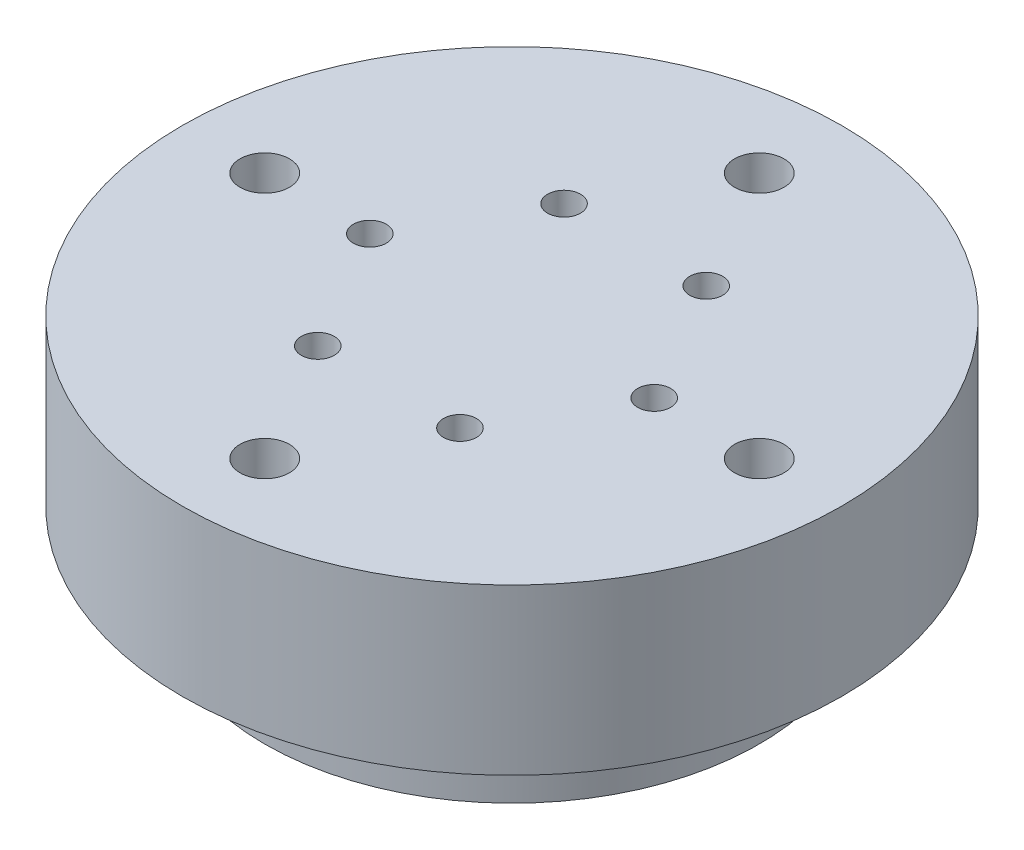
ISO-10303-21;
HEADER;
FILE_DESCRIPTION(('STEP AP214'),'2;1');
FILE_NAME('part.step','',(''),(''),'','','');
FILE_SCHEMA(('AUTOMOTIVE_DESIGN { 1 0 10303 214 1 1 1 1 }'));
ENDSEC;
DATA;
#1=APPLICATION_CONTEXT('core data for automotive mechanical design processes');
#2=APPLICATION_PROTOCOL_DEFINITION('international standard','automotive_design',2000,#1);
#3=PRODUCT_CONTEXT('',#1,'mechanical');
#4=PRODUCT('Part','Part','',(#3));
#5=PRODUCT_RELATED_PRODUCT_CATEGORY('part','',(#4));
#6=PRODUCT_DEFINITION_FORMATION('','',#4);
#7=PRODUCT_DEFINITION_CONTEXT('part definition',#1,'design');
#8=PRODUCT_DEFINITION('design','',#6,#7);
#9=PRODUCT_DEFINITION_SHAPE('','',#8);
#10=(LENGTH_UNIT() NAMED_UNIT(*) SI_UNIT(.MILLI.,.METRE.));
#11=(NAMED_UNIT(*) PLANE_ANGLE_UNIT() SI_UNIT($,.RADIAN.));
#12=(NAMED_UNIT(*) SI_UNIT($,.STERADIAN.) SOLID_ANGLE_UNIT());
#13=UNCERTAINTY_MEASURE_WITH_UNIT(LENGTH_MEASURE(1.E-05),#10,'distance_accuracy_value','');
#14=(GEOMETRIC_REPRESENTATION_CONTEXT(3) GLOBAL_UNCERTAINTY_ASSIGNED_CONTEXT((#13)) GLOBAL_UNIT_ASSIGNED_CONTEXT((#10,
#11,#12)) REPRESENTATION_CONTEXT('',''));
#15=CARTESIAN_POINT('',(0.,0.,0.));
#16=DIRECTION('',(0.,0.,1.));
#17=DIRECTION('',(1.,0.,0.));
#18=AXIS2_PLACEMENT_3D('',#15,#16,#17);
#19=CARTESIAN_POINT('',(0.,30.,0.));
#20=DIRECTION('',(0.,-1.,0.));
#21=DIRECTION('',(0.,0.,-1.));
#22=AXIS2_PLACEMENT_3D('',#19,#20,#21);
#23=CYLINDRICAL_SURFACE('',#22,30.);
#24=CARTESIAN_POINT('',(0.,0.,0.));
#25=DIRECTION('',(0.,1.,0.));
#26=DIRECTION('',(0.,0.,1.));
#27=AXIS2_PLACEMENT_3D('',#24,#25,#26);
#28=CIRCLE('',#27,30.);
#29=CARTESIAN_POINT('',(0.,0.,30.));
#30=VERTEX_POINT('',#29);
#31=EDGE_CURVE('E106',#30,#30,#28,.T.);
#32=ORIENTED_EDGE('',*,*,#31,.T.);
#33=EDGE_LOOP('',(#32));
#34=FACE_BOUND('',#33,.T.);
#35=CARTESIAN_POINT('',(0.,10.,0.));
#36=DIRECTION('',(0.,1.,0.));
#37=DIRECTION('',(0.,0.,1.));
#38=AXIS2_PLACEMENT_3D('',#35,#36,#37);
#39=CIRCLE('',#38,30.);
#40=CARTESIAN_POINT('',(29.85,10.,2.99624765331596));
#41=VERTEX_POINT('',#40);
#42=CARTESIAN_POINT('',(29.85,10.,-2.99624765331552));
#43=VERTEX_POINT('',#42);
#44=EDGE_CURVE('E82',#41,#43,#39,.T.);
#45=ORIENTED_EDGE('',*,*,#44,.F.);
#46=CARTESIAN_POINT('',(0.,10.,0.));
#47=DIRECTION('',(0.,1.,0.));
#48=DIRECTION('',(0.,0.,1.));
#49=AXIS2_PLACEMENT_3D('',#46,#47,#48);
#50=CIRCLE('',#49,30.);
#51=CARTESIAN_POINT('',(2.99624765331542,10.,29.85));
#52=VERTEX_POINT('',#51);
#53=EDGE_CURVE('E11',#52,#41,#50,.T.);
#54=ORIENTED_EDGE('',*,*,#53,.F.);
#55=CARTESIAN_POINT('',(0.,10.,0.));
#56=DIRECTION('',(0.,1.,0.));
#57=DIRECTION('',(0.,0.,1.));
#58=AXIS2_PLACEMENT_3D('',#55,#56,#57);
#59=CIRCLE('',#58,30.);
#60=CARTESIAN_POINT('',(-2.99624765331604,10.,29.85));
#61=VERTEX_POINT('',#60);
#62=EDGE_CURVE('E182',#61,#52,#59,.T.);
#63=ORIENTED_EDGE('',*,*,#62,.F.);
#64=CARTESIAN_POINT('',(-29.85,10.,2.99624765331573));
#65=VERTEX_POINT('',#64);
#66=EDGE_CURVE('E44',#65,#61,#50,.T.);
#67=ORIENTED_EDGE('',*,*,#66,.F.);
#68=CARTESIAN_POINT('',(0.,10.,0.));
#69=DIRECTION('',(0.,1.,0.));
#70=DIRECTION('',(0.,0.,1.));
#71=AXIS2_PLACEMENT_3D('',#68,#69,#70);
#72=CIRCLE('',#71,30.);
#73=CARTESIAN_POINT('',(-29.85,10.,-2.99624765331575));
#74=VERTEX_POINT('',#73);
#75=EDGE_CURVE('E183',#74,#65,#72,.T.);
#76=ORIENTED_EDGE('',*,*,#75,.F.);
#77=CARTESIAN_POINT('',(-2.99624765331562,10.,-29.85));
#78=VERTEX_POINT('',#77);
#79=EDGE_CURVE('E129',#78,#74,#50,.T.);
#80=ORIENTED_EDGE('',*,*,#79,.F.);
#81=CARTESIAN_POINT('',(0.,10.,0.));
#82=DIRECTION('',(0.,1.,0.));
#83=DIRECTION('',(0.,0.,1.));
#84=AXIS2_PLACEMENT_3D('',#81,#82,#83);
#85=CIRCLE('',#84,30.);
#86=CARTESIAN_POINT('',(2.99624765331585,10.,-29.85));
#87=VERTEX_POINT('',#86);
#88=EDGE_CURVE('E188',#87,#78,#85,.T.);
#89=ORIENTED_EDGE('',*,*,#88,.F.);
#90=EDGE_CURVE('E49',#43,#87,#50,.T.);
#91=ORIENTED_EDGE('',*,*,#90,.F.);
#92=EDGE_LOOP('',(#45,#54,#63,#67,#76,#80,#89,#91));
#93=FACE_BOUND('',#92,.T.);
#94=ADVANCED_FACE('F41',(#34,#93),#23,.T.);
#95=CARTESIAN_POINT('',(0.,30.,0.));
#96=DIRECTION('',(0.,1.,0.));
#97=DIRECTION('',(0.,0.,1.));
#98=AXIS2_PLACEMENT_3D('',#95,#96,#97);
#99=PLANE('',#98);
#100=CARTESIAN_POINT('',(30.,30.,2.09488880330588E-13));
#101=DIRECTION('',(0.,1.,0.));
#102=DIRECTION('',(0.,0.,1.));
#103=AXIS2_PLACEMENT_3D('',#100,#101,#102);
#104=CIRCLE('',#103,3.);
#105=CARTESIAN_POINT('',(30.,30.,3.00000000000021));
#106=VERTEX_POINT('',#105);
#107=EDGE_CURVE('E121',#106,#106,#104,.T.);
#108=ORIENTED_EDGE('',*,*,#107,.F.);
#109=EDGE_LOOP('',(#108));
#110=FACE_BOUND('',#109,.T.);
#111=CARTESIAN_POINT('',(1.04744440165294E-13,30.,-30.));
#112=DIRECTION('',(0.,1.,0.));
#113=DIRECTION('',(0.,0.,1.));
#114=AXIS2_PLACEMENT_3D('',#111,#112,#113);
#115=CIRCLE('',#114,3.);
#116=CARTESIAN_POINT('',(1.04744440165294E-13,30.,-27.));
#117=VERTEX_POINT('',#116);
#118=EDGE_CURVE('E118',#117,#117,#115,.T.);
#119=ORIENTED_EDGE('',*,*,#118,.F.);
#120=EDGE_LOOP('',(#119));
#121=FACE_BOUND('',#120,.T.);
#122=CARTESIAN_POINT('',(-3.14233320495882E-13,30.,30.));
#123=DIRECTION('',(0.,1.,0.));
#124=DIRECTION('',(0.,0.,1.));
#125=AXIS2_PLACEMENT_3D('',#122,#123,#124);
#126=CIRCLE('',#125,3.);
#127=CARTESIAN_POINT('',(-3.14233320495882E-13,30.,33.));
#128=VERTEX_POINT('',#127);
#129=EDGE_CURVE('E84',#128,#128,#126,.T.);
#130=ORIENTED_EDGE('',*,*,#129,.F.);
#131=EDGE_LOOP('',(#130));
#132=FACE_BOUND('',#131,.T.);
#133=CARTESIAN_POINT('',(-30.,30.,0.));
#134=DIRECTION('',(0.,1.,0.));
#135=DIRECTION('',(0.,0.,1.));
#136=AXIS2_PLACEMENT_3D('',#133,#134,#135);
#137=CIRCLE('',#136,3.);
#138=CARTESIAN_POINT('',(-30.,30.,3.));
#139=VERTEX_POINT('',#138);
#140=EDGE_CURVE('E115',#139,#139,#137,.T.);
#141=ORIENTED_EDGE('',*,*,#140,.F.);
#142=EDGE_LOOP('',(#141));
#143=FACE_BOUND('',#142,.T.);
#144=CARTESIAN_POINT('',(0.,30.,0.));
#145=DIRECTION('',(0.,1.,0.));
#146=DIRECTION('',(0.,0.,1.));
#147=AXIS2_PLACEMENT_3D('',#144,#145,#146);
#148=CIRCLE('',#147,40.);
#149=CARTESIAN_POINT('',(0.,30.,40.));
#150=VERTEX_POINT('',#149);
#151=EDGE_CURVE('E124',#150,#150,#148,.T.);
#152=ORIENTED_EDGE('',*,*,#151,.T.);
#153=EDGE_LOOP('',(#152));
#154=FACE_BOUND('',#153,.T.);
#155=CARTESIAN_POINT('',(-17.25,30.,-2.41993924898765E-13));
#156=DIRECTION('',(0.,1.,0.));
#157=DIRECTION('',(0.,0.,1.));
#158=AXIS2_PLACEMENT_3D('',#155,#156,#157);
#159=CIRCLE('',#158,2.);
#160=CARTESIAN_POINT('',(-17.25,30.,1.99999999999976));
#161=VERTEX_POINT('',#160);
#162=EDGE_CURVE('E192',#161,#161,#159,.T.);
#163=ORIENTED_EDGE('',*,*,#162,.F.);
#164=EDGE_LOOP('',(#163));
#165=FACE_BOUND('',#164,.T.);
#166=CARTESIAN_POINT('',(-8.62500000000018,30.,14.9389382152815));
#167=DIRECTION('',(0.,1.,0.));
#168=DIRECTION('',(0.,0.,1.));
#169=AXIS2_PLACEMENT_3D('',#166,#167,#168);
#170=CIRCLE('',#169,2.);
#171=CARTESIAN_POINT('',(-8.62500000000018,30.,16.9389382152815));
#172=VERTEX_POINT('',#171);
#173=EDGE_CURVE('E198',#172,#172,#170,.T.);
#174=ORIENTED_EDGE('',*,*,#173,.F.);
#175=EDGE_LOOP('',(#174));
#176=FACE_BOUND('',#175,.T.);
#177=CARTESIAN_POINT('',(8.62499999999986,30.,14.9389382152817));
#178=DIRECTION('',(0.,1.,0.));
#179=DIRECTION('',(0.,0.,1.));
#180=AXIS2_PLACEMENT_3D('',#177,#178,#179);
#181=CIRCLE('',#180,2.);
#182=CARTESIAN_POINT('',(8.62499999999986,30.,16.9389382152817));
#183=VERTEX_POINT('',#182);
#184=EDGE_CURVE('E204',#183,#183,#181,.T.);
#185=ORIENTED_EDGE('',*,*,#184,.F.);
#186=EDGE_LOOP('',(#185));
#187=FACE_BOUND('',#186,.T.);
#188=CARTESIAN_POINT('',(17.25,30.,1.21430643318376E-13));
#189=DIRECTION('',(0.,1.,0.));
#190=DIRECTION('',(0.,0.,1.));
#191=AXIS2_PLACEMENT_3D('',#188,#189,#190);
#192=CIRCLE('',#191,2.);
#193=CARTESIAN_POINT('',(17.25,30.,2.00000000000012));
#194=VERTEX_POINT('',#193);
#195=EDGE_CURVE('E210',#194,#194,#192,.T.);
#196=ORIENTED_EDGE('',*,*,#195,.F.);
#197=EDGE_LOOP('',(#196));
#198=FACE_BOUND('',#197,.T.);
#199=CARTESIAN_POINT('',(8.62500000000007,30.,-14.9389382152815));
#200=DIRECTION('',(0.,1.,0.));
#201=DIRECTION('',(0.,0.,1.));
#202=AXIS2_PLACEMENT_3D('',#199,#200,#201);
#203=CIRCLE('',#202,2.);
#204=CARTESIAN_POINT('',(8.62500000000007,30.,-12.9389382152815));
#205=VERTEX_POINT('',#204);
#206=EDGE_CURVE('E216',#205,#205,#203,.T.);
#207=ORIENTED_EDGE('',*,*,#206,.F.);
#208=EDGE_LOOP('',(#207));
#209=FACE_BOUND('',#208,.T.);
#210=CARTESIAN_POINT('',(-8.62499999999976,30.,-14.9389382152817));
#211=DIRECTION('',(0.,1.,0.));
#212=DIRECTION('',(0.,0.,1.));
#213=AXIS2_PLACEMENT_3D('',#210,#211,#212);
#214=CIRCLE('',#213,2.);
#215=CARTESIAN_POINT('',(-8.62499999999976,30.,-12.9389382152817));
#216=VERTEX_POINT('',#215);
#217=EDGE_CURVE('E222',#216,#216,#214,.T.);
#218=ORIENTED_EDGE('',*,*,#217,.F.);
#219=EDGE_LOOP('',(#218));
#220=FACE_BOUND('',#219,.T.);
#221=ADVANCED_FACE('F151',(#110,#121,#132,#143,#154,#165,#176,#187,#198,#209,#220),#99,.T.);
#222=CARTESIAN_POINT('',(0.,0.,0.));
#223=DIRECTION('',(0.,1.,0.));
#224=DIRECTION('',(0.,0.,1.));
#225=AXIS2_PLACEMENT_3D('',#222,#223,#224);
#226=PLANE('',#225);
#227=ORIENTED_EDGE('',*,*,#31,.F.);
#228=EDGE_LOOP('',(#227));
#229=FACE_BOUND('',#228,.T.);
#230=CARTESIAN_POINT('',(-17.25,0.,-2.41993924898765E-13));
#231=DIRECTION('',(0.,1.,0.));
#232=DIRECTION('',(0.,0.,1.));
#233=AXIS2_PLACEMENT_3D('',#230,#231,#232);
#234=CIRCLE('',#233,2.);
#235=CARTESIAN_POINT('',(-17.25,0.,1.99999999999976));
#236=VERTEX_POINT('',#235);
#237=EDGE_CURVE('E186',#236,#236,#234,.T.);
#238=ORIENTED_EDGE('',*,*,#237,.T.);
#239=EDGE_LOOP('',(#238));
#240=FACE_BOUND('',#239,.T.);
#241=CARTESIAN_POINT('',(-8.62500000000018,0.,14.9389382152815));
#242=DIRECTION('',(0.,1.,0.));
#243=DIRECTION('',(0.,0.,1.));
#244=AXIS2_PLACEMENT_3D('',#241,#242,#243);
#245=CIRCLE('',#244,2.);
#246=CARTESIAN_POINT('',(-8.62500000000018,0.,16.9389382152815));
#247=VERTEX_POINT('',#246);
#248=EDGE_CURVE('E195',#247,#247,#245,.T.);
#249=ORIENTED_EDGE('',*,*,#248,.T.);
#250=EDGE_LOOP('',(#249));
#251=FACE_BOUND('',#250,.T.);
#252=CARTESIAN_POINT('',(8.62499999999986,0.,14.9389382152817));
#253=DIRECTION('',(0.,1.,0.));
#254=DIRECTION('',(0.,0.,1.));
#255=AXIS2_PLACEMENT_3D('',#252,#253,#254);
#256=CIRCLE('',#255,2.);
#257=CARTESIAN_POINT('',(8.62499999999986,0.,16.9389382152817));
#258=VERTEX_POINT('',#257);
#259=EDGE_CURVE('E201',#258,#258,#256,.T.);
#260=ORIENTED_EDGE('',*,*,#259,.T.);
#261=EDGE_LOOP('',(#260));
#262=FACE_BOUND('',#261,.T.);
#263=CARTESIAN_POINT('',(17.25,0.,1.21430643318376E-13));
#264=DIRECTION('',(0.,1.,0.));
#265=DIRECTION('',(0.,0.,1.));
#266=AXIS2_PLACEMENT_3D('',#263,#264,#265);
#267=CIRCLE('',#266,2.);
#268=CARTESIAN_POINT('',(17.25,0.,2.00000000000012));
#269=VERTEX_POINT('',#268);
#270=EDGE_CURVE('E207',#269,#269,#267,.T.);
#271=ORIENTED_EDGE('',*,*,#270,.T.);
#272=EDGE_LOOP('',(#271));
#273=FACE_BOUND('',#272,.T.);
#274=CARTESIAN_POINT('',(8.62500000000007,0.,-14.9389382152815));
#275=DIRECTION('',(0.,1.,0.));
#276=DIRECTION('',(0.,0.,1.));
#277=AXIS2_PLACEMENT_3D('',#274,#275,#276);
#278=CIRCLE('',#277,2.);
#279=CARTESIAN_POINT('',(8.62500000000007,0.,-12.9389382152815));
#280=VERTEX_POINT('',#279);
#281=EDGE_CURVE('E213',#280,#280,#278,.T.);
#282=ORIENTED_EDGE('',*,*,#281,.T.);
#283=EDGE_LOOP('',(#282));
#284=FACE_BOUND('',#283,.T.);
#285=CARTESIAN_POINT('',(-8.62499999999976,0.,-14.9389382152817));
#286=DIRECTION('',(0.,1.,0.));
#287=DIRECTION('',(0.,0.,1.));
#288=AXIS2_PLACEMENT_3D('',#285,#286,#287);
#289=CIRCLE('',#288,2.);
#290=CARTESIAN_POINT('',(-8.62499999999976,0.,-12.9389382152817));
#291=VERTEX_POINT('',#290);
#292=EDGE_CURVE('E219',#291,#291,#289,.T.);
#293=ORIENTED_EDGE('',*,*,#292,.T.);
#294=EDGE_LOOP('',(#293));
#295=FACE_BOUND('',#294,.T.);
#296=ADVANCED_FACE('F147',(#229,#240,#251,#262,#273,#284,#295),#226,.F.);
#297=CARTESIAN_POINT('',(30.,10.,2.09488880330588E-13));
#298=DIRECTION('',(0.,1.,0.));
#299=DIRECTION('',(0.,0.,1.));
#300=AXIS2_PLACEMENT_3D('',#297,#298,#299);
#301=CYLINDRICAL_SURFACE('',#300,3.);
#302=ORIENTED_EDGE('',*,*,#107,.T.);
#303=EDGE_LOOP('',(#302));
#304=FACE_BOUND('',#303,.T.);
#305=CARTESIAN_POINT('',(30.,10.,2.09488880330588E-13));
#306=DIRECTION('',(0.,1.,0.));
#307=DIRECTION('',(0.,0.,1.));
#308=AXIS2_PLACEMENT_3D('',#305,#306,#307);
#309=CIRCLE('',#308,3.);
#310=EDGE_CURVE('E97',#41,#43,#309,.T.);
#311=ORIENTED_EDGE('',*,*,#310,.F.);
#312=CARTESIAN_POINT('',(30.,10.,2.09488880330588E-13));
#313=DIRECTION('',(0.,1.,0.));
#314=DIRECTION('',(0.,0.,1.));
#315=AXIS2_PLACEMENT_3D('',#312,#313,#314);
#316=CIRCLE('',#315,3.);
#317=EDGE_CURVE('E55',#43,#41,#316,.T.);
#318=ORIENTED_EDGE('',*,*,#317,.F.);
#319=EDGE_LOOP('',(#311,#318));
#320=FACE_BOUND('',#319,.T.);
#321=ADVANCED_FACE('F101',(#304,#320),#301,.F.);
#322=CARTESIAN_POINT('',(1.04744440165294E-13,10.,-30.));
#323=DIRECTION('',(0.,1.,0.));
#324=DIRECTION('',(0.,0.,1.));
#325=AXIS2_PLACEMENT_3D('',#322,#323,#324);
#326=CYLINDRICAL_SURFACE('',#325,3.);
#327=ORIENTED_EDGE('',*,*,#118,.T.);
#328=EDGE_LOOP('',(#327));
#329=FACE_BOUND('',#328,.T.);
#330=CARTESIAN_POINT('',(1.04744440165294E-13,10.,-30.));
#331=DIRECTION('',(0.,1.,0.));
#332=DIRECTION('',(0.,0.,1.));
#333=AXIS2_PLACEMENT_3D('',#330,#331,#332);
#334=CIRCLE('',#333,3.);
#335=EDGE_CURVE('E103',#87,#78,#334,.T.);
#336=ORIENTED_EDGE('',*,*,#335,.F.);
#337=CARTESIAN_POINT('',(1.04744440165294E-13,10.,-30.));
#338=DIRECTION('',(0.,1.,0.));
#339=DIRECTION('',(0.,0.,1.));
#340=AXIS2_PLACEMENT_3D('',#337,#338,#339);
#341=CIRCLE('',#340,3.);
#342=EDGE_CURVE('E62',#78,#87,#341,.T.);
#343=ORIENTED_EDGE('',*,*,#342,.F.);
#344=EDGE_LOOP('',(#336,#343));
#345=FACE_BOUND('',#344,.T.);
#346=ADVANCED_FACE('F135',(#329,#345),#326,.F.);
#347=CARTESIAN_POINT('',(-30.,10.,0.));
#348=DIRECTION('',(0.,1.,0.));
#349=DIRECTION('',(0.,0.,1.));
#350=AXIS2_PLACEMENT_3D('',#347,#348,#349);
#351=CYLINDRICAL_SURFACE('',#350,3.);
#352=ORIENTED_EDGE('',*,*,#140,.T.);
#353=EDGE_LOOP('',(#352));
#354=FACE_BOUND('',#353,.T.);
#355=CARTESIAN_POINT('',(-30.,10.,0.));
#356=DIRECTION('',(0.,1.,0.));
#357=DIRECTION('',(0.,0.,1.));
#358=AXIS2_PLACEMENT_3D('',#355,#356,#357);
#359=CIRCLE('',#358,3.);
#360=EDGE_CURVE('E109',#74,#65,#359,.T.);
#361=ORIENTED_EDGE('',*,*,#360,.F.);
#362=CARTESIAN_POINT('',(-30.,10.,0.));
#363=DIRECTION('',(0.,1.,0.));
#364=DIRECTION('',(0.,0.,1.));
#365=AXIS2_PLACEMENT_3D('',#362,#363,#364);
#366=CIRCLE('',#365,3.);
#367=EDGE_CURVE('E180',#65,#74,#366,.T.);
#368=ORIENTED_EDGE('',*,*,#367,.F.);
#369=EDGE_LOOP('',(#361,#368));
#370=FACE_BOUND('',#369,.T.);
#371=ADVANCED_FACE('F137',(#354,#370),#351,.F.);
#372=CARTESIAN_POINT('',(-3.14233320495882E-13,10.,30.));
#373=DIRECTION('',(0.,1.,0.));
#374=DIRECTION('',(0.,0.,1.));
#375=AXIS2_PLACEMENT_3D('',#372,#373,#374);
#376=CYLINDRICAL_SURFACE('',#375,3.);
#377=ORIENTED_EDGE('',*,*,#129,.T.);
#378=EDGE_LOOP('',(#377));
#379=FACE_BOUND('',#378,.T.);
#380=CARTESIAN_POINT('',(-3.14233320495882E-13,10.,30.));
#381=DIRECTION('',(0.,1.,0.));
#382=DIRECTION('',(0.,0.,1.));
#383=AXIS2_PLACEMENT_3D('',#380,#381,#382);
#384=CIRCLE('',#383,3.);
#385=EDGE_CURVE('E100',#61,#52,#384,.T.);
#386=ORIENTED_EDGE('',*,*,#385,.F.);
#387=CARTESIAN_POINT('',(-3.14233320495882E-13,10.,30.));
#388=DIRECTION('',(0.,1.,0.));
#389=DIRECTION('',(0.,0.,1.));
#390=AXIS2_PLACEMENT_3D('',#387,#388,#389);
#391=CIRCLE('',#390,3.);
#392=EDGE_CURVE('E176',#52,#61,#391,.T.);
#393=ORIENTED_EDGE('',*,*,#392,.F.);
#394=EDGE_LOOP('',(#386,#393));
#395=FACE_BOUND('',#394,.T.);
#396=ADVANCED_FACE('F144',(#379,#395),#376,.F.);
#397=CARTESIAN_POINT('',(0.,10.,0.));
#398=DIRECTION('',(0.,1.,0.));
#399=DIRECTION('',(0.,0.,1.));
#400=AXIS2_PLACEMENT_3D('',#397,#398,#399);
#401=CYLINDRICAL_SURFACE('',#400,40.);
#402=CARTESIAN_POINT('',(0.,10.,0.));
#403=DIRECTION('',(0.,1.,0.));
#404=DIRECTION('',(0.,0.,1.));
#405=AXIS2_PLACEMENT_3D('',#402,#403,#404);
#406=CIRCLE('',#405,40.);
#407=CARTESIAN_POINT('',(0.,10.,40.));
#408=VERTEX_POINT('',#407);
#409=EDGE_CURVE('E102',#408,#408,#406,.T.);
#410=ORIENTED_EDGE('',*,*,#409,.T.);
#411=EDGE_LOOP('',(#410));
#412=FACE_BOUND('',#411,.T.);
#413=ORIENTED_EDGE('',*,*,#151,.F.);
#414=EDGE_LOOP('',(#413));
#415=FACE_BOUND('',#414,.T.);
#416=ADVANCED_FACE('F167',(#412,#415),#401,.T.);
#417=CARTESIAN_POINT('',(0.,10.,0.));
#418=DIRECTION('',(0.,1.,0.));
#419=DIRECTION('',(0.,0.,1.));
#420=AXIS2_PLACEMENT_3D('',#417,#418,#419);
#421=PLANE('',#420);
#422=ORIENTED_EDGE('',*,*,#385,.T.);
#423=ORIENTED_EDGE('',*,*,#53,.T.);
#424=ORIENTED_EDGE('',*,*,#310,.T.);
#425=ORIENTED_EDGE('',*,*,#90,.T.);
#426=ORIENTED_EDGE('',*,*,#335,.T.);
#427=ORIENTED_EDGE('',*,*,#79,.T.);
#428=ORIENTED_EDGE('',*,*,#360,.T.);
#429=ORIENTED_EDGE('',*,*,#66,.T.);
#430=EDGE_LOOP('',(#422,#423,#424,#425,#426,#427,#428,#429));
#431=FACE_BOUND('',#430,.T.);
#432=ORIENTED_EDGE('',*,*,#409,.F.);
#433=EDGE_LOOP('',(#432));
#434=FACE_BOUND('',#433,.T.);
#435=ADVANCED_FACE('F95',(#431,#434),#421,.F.);
#436=CARTESIAN_POINT('',(0.,10.,0.));
#437=DIRECTION('',(0.,1.,0.));
#438=DIRECTION('',(0.,0.,1.));
#439=AXIS2_PLACEMENT_3D('',#436,#437,#438);
#440=PLANE('',#439);
#441=ORIENTED_EDGE('',*,*,#62,.T.);
#442=ORIENTED_EDGE('',*,*,#392,.T.);
#443=EDGE_LOOP('',(#441,#442));
#444=FACE_BOUND('',#443,.T.);
#445=ADVANCED_FACE('F264',(#444),#440,.T.);
#446=CARTESIAN_POINT('',(0.,10.,0.));
#447=DIRECTION('',(0.,1.,0.));
#448=DIRECTION('',(0.,0.,1.));
#449=AXIS2_PLACEMENT_3D('',#446,#447,#448);
#450=PLANE('',#449);
#451=ORIENTED_EDGE('',*,*,#75,.T.);
#452=ORIENTED_EDGE('',*,*,#367,.T.);
#453=EDGE_LOOP('',(#451,#452));
#454=FACE_BOUND('',#453,.T.);
#455=ADVANCED_FACE('F262',(#454),#450,.T.);
#456=CARTESIAN_POINT('',(0.,10.,0.));
#457=DIRECTION('',(0.,1.,0.));
#458=DIRECTION('',(0.,0.,1.));
#459=AXIS2_PLACEMENT_3D('',#456,#457,#458);
#460=PLANE('',#459);
#461=ORIENTED_EDGE('',*,*,#88,.T.);
#462=ORIENTED_EDGE('',*,*,#342,.T.);
#463=EDGE_LOOP('',(#461,#462));
#464=FACE_BOUND('',#463,.T.);
#465=ADVANCED_FACE('F259',(#464),#460,.T.);
#466=CARTESIAN_POINT('',(0.,10.,0.));
#467=DIRECTION('',(0.,1.,0.));
#468=DIRECTION('',(0.,0.,1.));
#469=AXIS2_PLACEMENT_3D('',#466,#467,#468);
#470=PLANE('',#469);
#471=ORIENTED_EDGE('',*,*,#44,.T.);
#472=ORIENTED_EDGE('',*,*,#317,.T.);
#473=EDGE_LOOP('',(#471,#472));
#474=FACE_BOUND('',#473,.T.);
#475=ADVANCED_FACE('F81',(#474),#470,.T.);
#476=CARTESIAN_POINT('',(-17.25,0.,-2.41993924898765E-13));
#477=DIRECTION('',(0.,1.,0.));
#478=DIRECTION('',(0.,0.,1.));
#479=AXIS2_PLACEMENT_3D('',#476,#477,#478);
#480=CYLINDRICAL_SURFACE('',#479,2.);
#481=ORIENTED_EDGE('',*,*,#237,.F.);
#482=EDGE_LOOP('',(#481));
#483=FACE_BOUND('',#482,.T.);
#484=ORIENTED_EDGE('',*,*,#162,.T.);
#485=EDGE_LOOP('',(#484));
#486=FACE_BOUND('',#485,.T.);
#487=ADVANCED_FACE('F253',(#483,#486),#480,.F.);
#488=CARTESIAN_POINT('',(-8.62500000000018,0.,14.9389382152815));
#489=DIRECTION('',(0.,1.,0.));
#490=DIRECTION('',(0.,0.,1.));
#491=AXIS2_PLACEMENT_3D('',#488,#489,#490);
#492=CYLINDRICAL_SURFACE('',#491,2.);
#493=ORIENTED_EDGE('',*,*,#248,.F.);
#494=EDGE_LOOP('',(#493));
#495=FACE_BOUND('',#494,.T.);
#496=ORIENTED_EDGE('',*,*,#173,.T.);
#497=EDGE_LOOP('',(#496));
#498=FACE_BOUND('',#497,.T.);
#499=ADVANCED_FACE('F249',(#495,#498),#492,.F.);
#500=CARTESIAN_POINT('',(8.62499999999986,0.,14.9389382152817));
#501=DIRECTION('',(0.,1.,0.));
#502=DIRECTION('',(0.,0.,1.));
#503=AXIS2_PLACEMENT_3D('',#500,#501,#502);
#504=CYLINDRICAL_SURFACE('',#503,2.);
#505=ORIENTED_EDGE('',*,*,#259,.F.);
#506=EDGE_LOOP('',(#505));
#507=FACE_BOUND('',#506,.T.);
#508=ORIENTED_EDGE('',*,*,#184,.T.);
#509=EDGE_LOOP('',(#508));
#510=FACE_BOUND('',#509,.T.);
#511=ADVANCED_FACE('F245',(#507,#510),#504,.F.);
#512=CARTESIAN_POINT('',(17.25,0.,1.21430643318376E-13));
#513=DIRECTION('',(0.,1.,0.));
#514=DIRECTION('',(0.,0.,1.));
#515=AXIS2_PLACEMENT_3D('',#512,#513,#514);
#516=CYLINDRICAL_SURFACE('',#515,2.);
#517=ORIENTED_EDGE('',*,*,#270,.F.);
#518=EDGE_LOOP('',(#517));
#519=FACE_BOUND('',#518,.T.);
#520=ORIENTED_EDGE('',*,*,#195,.T.);
#521=EDGE_LOOP('',(#520));
#522=FACE_BOUND('',#521,.T.);
#523=ADVANCED_FACE('F239',(#519,#522),#516,.F.);
#524=CARTESIAN_POINT('',(8.62500000000007,0.,-14.9389382152815));
#525=DIRECTION('',(0.,1.,0.));
#526=DIRECTION('',(0.,0.,1.));
#527=AXIS2_PLACEMENT_3D('',#524,#525,#526);
#528=CYLINDRICAL_SURFACE('',#527,2.);
#529=ORIENTED_EDGE('',*,*,#281,.F.);
#530=EDGE_LOOP('',(#529));
#531=FACE_BOUND('',#530,.T.);
#532=ORIENTED_EDGE('',*,*,#206,.T.);
#533=EDGE_LOOP('',(#532));
#534=FACE_BOUND('',#533,.T.);
#535=ADVANCED_FACE('F232',(#531,#534),#528,.F.);
#536=CARTESIAN_POINT('',(-8.62499999999976,0.,-14.9389382152817));
#537=DIRECTION('',(0.,1.,0.));
#538=DIRECTION('',(0.,0.,1.));
#539=AXIS2_PLACEMENT_3D('',#536,#537,#538);
#540=CYLINDRICAL_SURFACE('',#539,2.);
#541=ORIENTED_EDGE('',*,*,#292,.F.);
#542=EDGE_LOOP('',(#541));
#543=FACE_BOUND('',#542,.T.);
#544=ORIENTED_EDGE('',*,*,#217,.T.);
#545=EDGE_LOOP('',(#544));
#546=FACE_BOUND('',#545,.T.);
#547=ADVANCED_FACE('F229',(#543,#546),#540,.F.);
#548=CLOSED_SHELL('',(#94,#221,#296,#321,#346,#371,#396,#416,#435,#445,#455,#465,#475,#487,#499,
#511,#523,#535,#547));
#549=MANIFOLD_SOLID_BREP('B2',#548);
#550=ADVANCED_BREP_SHAPE_REPRESENTATION('',(#18,#549),#14);
#551=SHAPE_DEFINITION_REPRESENTATION(#9,#550);
ENDSEC;
END-ISO-10303-21;
